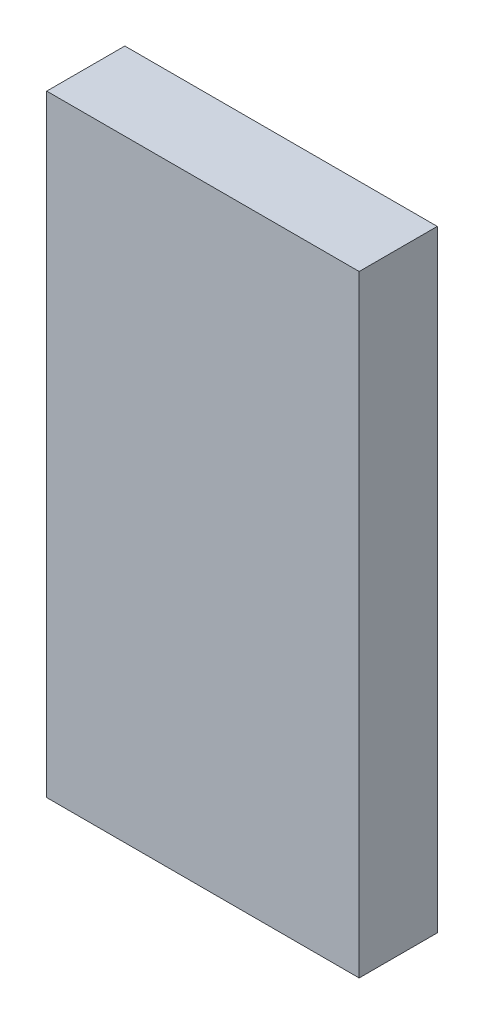
ISO-10303-21;
HEADER;
FILE_DESCRIPTION(('STEP AP214'),'2;1');
FILE_NAME('part.step','',(''),(''),'','','');
FILE_SCHEMA(('AUTOMOTIVE_DESIGN { 1 0 10303 214 1 1 1 1 }'));
ENDSEC;
DATA;
#1=APPLICATION_CONTEXT('core data for automotive mechanical design processes');
#2=APPLICATION_PROTOCOL_DEFINITION('international standard','automotive_design',2000,#1);
#3=PRODUCT_CONTEXT('',#1,'mechanical');
#4=PRODUCT('Part','Part','',(#3));
#5=PRODUCT_RELATED_PRODUCT_CATEGORY('part','',(#4));
#6=PRODUCT_DEFINITION_FORMATION('','',#4);
#7=PRODUCT_DEFINITION_CONTEXT('part definition',#1,'design');
#8=PRODUCT_DEFINITION('design','',#6,#7);
#9=PRODUCT_DEFINITION_SHAPE('','',#8);
#10=(LENGTH_UNIT() NAMED_UNIT(*) SI_UNIT(.MILLI.,.METRE.));
#11=(NAMED_UNIT(*) PLANE_ANGLE_UNIT() SI_UNIT($,.RADIAN.));
#12=(NAMED_UNIT(*) SI_UNIT($,.STERADIAN.) SOLID_ANGLE_UNIT());
#13=UNCERTAINTY_MEASURE_WITH_UNIT(LENGTH_MEASURE(1.E-05),#10,'distance_accuracy_value','');
#14=(GEOMETRIC_REPRESENTATION_CONTEXT(3) GLOBAL_UNCERTAINTY_ASSIGNED_CONTEXT((#13)) GLOBAL_UNIT_ASSIGNED_CONTEXT((#10,
#11,#12)) REPRESENTATION_CONTEXT('',''));
#15=CARTESIAN_POINT('',(0.,0.,0.));
#16=DIRECTION('',(0.,0.,1.));
#17=DIRECTION('',(1.,0.,0.));
#18=AXIS2_PLACEMENT_3D('',#15,#16,#17);
#19=CARTESIAN_POINT('',(-3.27777777777778,14.4593253968254,3.));
#20=DIRECTION('',(-1.,0.,0.));
#21=DIRECTION('',(0.,-1.,0.));
#22=AXIS2_PLACEMENT_3D('',#19,#20,#21);
#23=PLANE('',#22);
#24=DIRECTION('',(0.,1.,0.));
#25=VECTOR('',#24,1.);
#26=CARTESIAN_POINT('',(-3.27777777777778,14.4593253968254,0.));
#27=LINE('',#26,#25);
#28=CARTESIAN_POINT('',(-3.27777777777778,-9.0406746031746,0.));
#29=VERTEX_POINT('',#28);
#30=CARTESIAN_POINT('',(-3.27777777777778,14.4593253968254,0.));
#31=VERTEX_POINT('',#30);
#32=EDGE_CURVE('E106',#29,#31,#27,.T.);
#33=ORIENTED_EDGE('',*,*,#32,.T.);
#34=DIRECTION('',(0.,0.,-1.));
#35=VECTOR('',#34,1.);
#36=CARTESIAN_POINT('',(-3.27777777777778,14.4593253968254,3.));
#37=LINE('',#36,#35);
#38=CARTESIAN_POINT('',(-3.27777777777778,14.4593253968254,3.));
#39=VERTEX_POINT('',#38);
#40=EDGE_CURVE('E11',#39,#31,#37,.T.);
#41=ORIENTED_EDGE('',*,*,#40,.F.);
#42=DIRECTION('',(0.,1.,0.));
#43=VECTOR('',#42,1.);
#44=CARTESIAN_POINT('',(-3.27777777777778,14.4593253968254,3.));
#45=LINE('',#44,#43);
#46=CARTESIAN_POINT('',(-3.27777777777778,-9.0406746031746,3.));
#47=VERTEX_POINT('',#46);
#48=EDGE_CURVE('E90',#47,#39,#45,.T.);
#49=ORIENTED_EDGE('',*,*,#48,.F.);
#50=DIRECTION('',(0.,0.,-1.));
#51=VECTOR('',#50,1.);
#52=CARTESIAN_POINT('',(-3.27777777777778,-9.0406746031746,3.));
#53=LINE('',#52,#51);
#54=EDGE_CURVE('E102',#47,#29,#53,.T.);
#55=ORIENTED_EDGE('',*,*,#54,.T.);
#56=EDGE_LOOP('',(#33,#41,#49,#55));
#57=FACE_BOUND('',#56,.T.);
#58=ADVANCED_FACE('F38',(#57),#23,.F.);
#59=CARTESIAN_POINT('',(-15.2777777777778,14.4593253968254,3.));
#60=DIRECTION('',(0.,-1.,0.));
#61=DIRECTION('',(0.,0.,-1.));
#62=AXIS2_PLACEMENT_3D('',#59,#60,#61);
#63=PLANE('',#62);
#64=DIRECTION('',(-1.,0.,0.));
#65=VECTOR('',#64,1.);
#66=CARTESIAN_POINT('',(-15.2777777777778,14.4593253968254,0.));
#67=LINE('',#66,#65);
#68=CARTESIAN_POINT('',(-15.2777777777778,14.4593253968254,0.));
#69=VERTEX_POINT('',#68);
#70=EDGE_CURVE('E95',#31,#69,#67,.T.);
#71=ORIENTED_EDGE('',*,*,#70,.T.);
#72=DIRECTION('',(0.,0.,-1.));
#73=VECTOR('',#72,1.);
#74=CARTESIAN_POINT('',(-15.2777777777778,14.4593253968254,3.));
#75=LINE('',#74,#73);
#76=CARTESIAN_POINT('',(-15.2777777777778,14.4593253968254,3.));
#77=VERTEX_POINT('',#76);
#78=EDGE_CURVE('E47',#77,#69,#75,.T.);
#79=ORIENTED_EDGE('',*,*,#78,.F.);
#80=DIRECTION('',(-1.,0.,0.));
#81=VECTOR('',#80,1.);
#82=CARTESIAN_POINT('',(-15.2777777777778,14.4593253968254,3.));
#83=LINE('',#82,#81);
#84=EDGE_CURVE('E85',#39,#77,#83,.T.);
#85=ORIENTED_EDGE('',*,*,#84,.F.);
#86=ORIENTED_EDGE('',*,*,#40,.T.);
#87=EDGE_LOOP('',(#71,#79,#85,#86));
#88=FACE_BOUND('',#87,.T.);
#89=ADVANCED_FACE('F94',(#88),#63,.F.);
#90=CARTESIAN_POINT('',(-15.2777777777778,14.4593253968254,3.));
#91=DIRECTION('',(1.,0.,0.));
#92=DIRECTION('',(0.,1.,0.));
#93=AXIS2_PLACEMENT_3D('',#90,#91,#92);
#94=PLANE('',#93);
#95=DIRECTION('',(0.,-1.,0.));
#96=VECTOR('',#95,1.);
#97=CARTESIAN_POINT('',(-15.2777777777778,14.4593253968254,0.));
#98=LINE('',#97,#96);
#99=CARTESIAN_POINT('',(-15.2777777777778,-9.0406746031746,0.));
#100=VERTEX_POINT('',#99);
#101=EDGE_CURVE('E72',#69,#100,#98,.T.);
#102=ORIENTED_EDGE('',*,*,#101,.T.);
#103=DIRECTION('',(0.,0.,-1.));
#104=VECTOR('',#103,1.);
#105=CARTESIAN_POINT('',(-15.2777777777778,-9.0406746031746,3.));
#106=LINE('',#105,#104);
#107=CARTESIAN_POINT('',(-15.2777777777778,-9.0406746031746,3.));
#108=VERTEX_POINT('',#107);
#109=EDGE_CURVE('E97',#108,#100,#106,.T.);
#110=ORIENTED_EDGE('',*,*,#109,.F.);
#111=DIRECTION('',(0.,-1.,0.));
#112=VECTOR('',#111,1.);
#113=CARTESIAN_POINT('',(-15.2777777777778,14.4593253968254,3.));
#114=LINE('',#113,#112);
#115=EDGE_CURVE('E88',#77,#108,#114,.T.);
#116=ORIENTED_EDGE('',*,*,#115,.F.);
#117=ORIENTED_EDGE('',*,*,#78,.T.);
#118=EDGE_LOOP('',(#102,#110,#116,#117));
#119=FACE_BOUND('',#118,.T.);
#120=ADVANCED_FACE('F98',(#119),#94,.F.);
#121=CARTESIAN_POINT('',(-15.2777777777778,-9.0406746031746,3.));
#122=DIRECTION('',(0.,1.,0.));
#123=DIRECTION('',(0.,0.,1.));
#124=AXIS2_PLACEMENT_3D('',#121,#122,#123);
#125=PLANE('',#124);
#126=DIRECTION('',(1.,0.,0.));
#127=VECTOR('',#126,1.);
#128=CARTESIAN_POINT('',(-15.2777777777778,-9.0406746031746,0.));
#129=LINE('',#128,#127);
#130=EDGE_CURVE('E78',#100,#29,#129,.T.);
#131=ORIENTED_EDGE('',*,*,#130,.T.);
#132=ORIENTED_EDGE('',*,*,#54,.F.);
#133=DIRECTION('',(1.,0.,0.));
#134=VECTOR('',#133,1.);
#135=CARTESIAN_POINT('',(-15.2777777777778,-9.0406746031746,3.));
#136=LINE('',#135,#134);
#137=EDGE_CURVE('E55',#108,#47,#136,.T.);
#138=ORIENTED_EDGE('',*,*,#137,.F.);
#139=ORIENTED_EDGE('',*,*,#109,.T.);
#140=EDGE_LOOP('',(#131,#132,#138,#139));
#141=FACE_BOUND('',#140,.T.);
#142=ADVANCED_FACE('F119',(#141),#125,.F.);
#143=CARTESIAN_POINT('',(0.,0.,3.));
#144=DIRECTION('',(0.,0.,1.));
#145=DIRECTION('',(1.,0.,0.));
#146=AXIS2_PLACEMENT_3D('',#143,#144,#145);
#147=PLANE('',#146);
#148=ORIENTED_EDGE('',*,*,#48,.T.);
#149=ORIENTED_EDGE('',*,*,#84,.T.);
#150=ORIENTED_EDGE('',*,*,#115,.T.);
#151=ORIENTED_EDGE('',*,*,#137,.T.);
#152=EDGE_LOOP('',(#148,#149,#150,#151));
#153=FACE_BOUND('',#152,.T.);
#154=ADVANCED_FACE('F86',(#153),#147,.T.);
#155=CARTESIAN_POINT('',(0.,0.,0.));
#156=DIRECTION('',(0.,0.,1.));
#157=DIRECTION('',(1.,0.,0.));
#158=AXIS2_PLACEMENT_3D('',#155,#156,#157);
#159=PLANE('',#158);
#160=ORIENTED_EDGE('',*,*,#32,.F.);
#161=ORIENTED_EDGE('',*,*,#130,.F.);
#162=ORIENTED_EDGE('',*,*,#101,.F.);
#163=ORIENTED_EDGE('',*,*,#70,.F.);
#164=EDGE_LOOP('',(#160,#161,#162,#163));
#165=FACE_BOUND('',#164,.T.);
#166=ADVANCED_FACE('F122',(#165),#159,.F.);
#167=CLOSED_SHELL('',(#58,#89,#120,#142,#154,#166));
#168=MANIFOLD_SOLID_BREP('B2',#167);
#169=ADVANCED_BREP_SHAPE_REPRESENTATION('',(#18,#168),#14);
#170=SHAPE_DEFINITION_REPRESENTATION(#9,#169);
ENDSEC;
END-ISO-10303-21;
